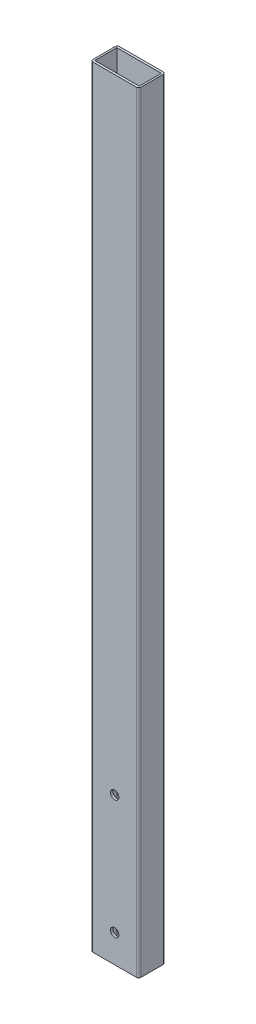
ISO-10303-21;
HEADER;
FILE_DESCRIPTION(('STEP AP214'),'2;1');
FILE_NAME('part.step','',(''),(''),'','','');
FILE_SCHEMA(('AUTOMOTIVE_DESIGN { 1 0 10303 214 1 1 1 1 }'));
ENDSEC;
DATA;
#1=APPLICATION_CONTEXT('core data for automotive mechanical design processes');
#2=APPLICATION_PROTOCOL_DEFINITION('international standard','automotive_design',2000,#1);
#3=PRODUCT_CONTEXT('',#1,'mechanical');
#4=PRODUCT('Part','Part','',(#3));
#5=PRODUCT_RELATED_PRODUCT_CATEGORY('part','',(#4));
#6=PRODUCT_DEFINITION_FORMATION('','',#4);
#7=PRODUCT_DEFINITION_CONTEXT('part definition',#1,'design');
#8=PRODUCT_DEFINITION('design','',#6,#7);
#9=PRODUCT_DEFINITION_SHAPE('','',#8);
#10=(LENGTH_UNIT() NAMED_UNIT(*) SI_UNIT(.MILLI.,.METRE.));
#11=(NAMED_UNIT(*) PLANE_ANGLE_UNIT() SI_UNIT($,.RADIAN.));
#12=(NAMED_UNIT(*) SI_UNIT($,.STERADIAN.) SOLID_ANGLE_UNIT());
#13=UNCERTAINTY_MEASURE_WITH_UNIT(LENGTH_MEASURE(1.E-05),#10,'distance_accuracy_value','');
#14=(GEOMETRIC_REPRESENTATION_CONTEXT(3) GLOBAL_UNCERTAINTY_ASSIGNED_CONTEXT((#13)) GLOBAL_UNIT_ASSIGNED_CONTEXT((#10,
#11,#12)) REPRESENTATION_CONTEXT('',''));
#15=CARTESIAN_POINT('',(0.,0.,0.));
#16=DIRECTION('',(0.,0.,1.));
#17=DIRECTION('',(1.,0.,0.));
#18=AXIS2_PLACEMENT_3D('',#15,#16,#17);
#19=CARTESIAN_POINT('',(0.,550.,0.));
#20=DIRECTION('',(0.,-1.,0.));
#21=DIRECTION('',(0.,0.,-1.));
#22=AXIS2_PLACEMENT_3D('',#19,#20,#21);
#23=PLANE('',#22);
#24=DIRECTION('',(-1.,0.,0.));
#25=VECTOR('',#24,1.);
#26=CARTESIAN_POINT('',(-17.145,550.,-9.525));
#27=LINE('',#26,#25);
#28=CARTESIAN_POINT('',(15.645,550.,-9.525));
#29=VERTEX_POINT('',#28);
#30=CARTESIAN_POINT('',(-15.645,550.,-9.525));
#31=VERTEX_POINT('',#30);
#32=EDGE_CURVE('E173',#29,#31,#27,.T.);
#33=ORIENTED_EDGE('',*,*,#32,.T.);
#34=CARTESIAN_POINT('',(-15.645,550.,-8.025));
#35=DIRECTION('',(0.,-1.,0.));
#36=DIRECTION('',(0.,0.,-1.));
#37=AXIS2_PLACEMENT_3D('',#34,#35,#36);
#38=CIRCLE('',#37,1.5);
#39=CARTESIAN_POINT('',(-17.145,550.,-8.025));
#40=VERTEX_POINT('',#39);
#41=EDGE_CURVE('E213',#31,#40,#38,.F.);
#42=ORIENTED_EDGE('',*,*,#41,.T.);
#43=DIRECTION('',(0.,0.,1.));
#44=VECTOR('',#43,1.);
#45=CARTESIAN_POINT('',(-17.145,550.,9.525));
#46=LINE('',#45,#44);
#47=CARTESIAN_POINT('',(-17.145,550.,8.025));
#48=VERTEX_POINT('',#47);
#49=EDGE_CURVE('E177',#40,#48,#46,.T.);
#50=ORIENTED_EDGE('',*,*,#49,.T.);
#51=CARTESIAN_POINT('',(-15.645,550.,8.025));
#52=DIRECTION('',(0.,-1.,0.));
#53=DIRECTION('',(0.,0.,-1.));
#54=AXIS2_PLACEMENT_3D('',#51,#52,#53);
#55=CIRCLE('',#54,1.5);
#56=CARTESIAN_POINT('',(-15.645,550.,9.525));
#57=VERTEX_POINT('',#56);
#58=EDGE_CURVE('E57',#48,#57,#55,.F.);
#59=ORIENTED_EDGE('',*,*,#58,.T.);
#60=DIRECTION('',(1.,0.,0.));
#61=VECTOR('',#60,1.);
#62=CARTESIAN_POINT('',(-17.145,550.,9.525));
#63=LINE('',#62,#61);
#64=CARTESIAN_POINT('',(15.645,550.,9.525));
#65=VERTEX_POINT('',#64);
#66=EDGE_CURVE('E179',#57,#65,#63,.T.);
#67=ORIENTED_EDGE('',*,*,#66,.T.);
#68=CARTESIAN_POINT('',(15.645,550.,8.025));
#69=DIRECTION('',(0.,-1.,0.));
#70=DIRECTION('',(0.,0.,-1.));
#71=AXIS2_PLACEMENT_3D('',#68,#69,#70);
#72=CIRCLE('',#71,1.5);
#73=CARTESIAN_POINT('',(17.145,550.,8.025));
#74=VERTEX_POINT('',#73);
#75=EDGE_CURVE('E208',#65,#74,#72,.F.);
#76=ORIENTED_EDGE('',*,*,#75,.T.);
#77=DIRECTION('',(0.,0.,-1.));
#78=VECTOR('',#77,1.);
#79=CARTESIAN_POINT('',(17.145,550.,9.525));
#80=LINE('',#79,#78);
#81=CARTESIAN_POINT('',(17.145,550.,-8.025));
#82=VERTEX_POINT('',#81);
#83=EDGE_CURVE('E170',#74,#82,#80,.T.);
#84=ORIENTED_EDGE('',*,*,#83,.T.);
#85=CARTESIAN_POINT('',(15.645,550.,-8.025));
#86=DIRECTION('',(0.,-1.,0.));
#87=DIRECTION('',(0.,0.,-1.));
#88=AXIS2_PLACEMENT_3D('',#85,#86,#87);
#89=CIRCLE('',#88,1.5);
#90=EDGE_CURVE('E211',#82,#29,#89,.F.);
#91=ORIENTED_EDGE('',*,*,#90,.T.);
#92=EDGE_LOOP('',(#33,#42,#50,#59,#67,#76,#84,#91));
#93=FACE_BOUND('',#92,.T.);
#94=DIRECTION('',(0.,0.,-1.));
#95=VECTOR('',#94,1.);
#96=CARTESIAN_POINT('',(15.875,550.,7.87400000000001));
#97=LINE('',#96,#95);
#98=CARTESIAN_POINT('',(15.875,550.,7.87400000000001));
#99=VERTEX_POINT('',#98);
#100=CARTESIAN_POINT('',(15.875,550.,-7.87399999999999));
#101=VERTEX_POINT('',#100);
#102=EDGE_CURVE('E127',#99,#101,#97,.T.);
#103=ORIENTED_EDGE('',*,*,#102,.F.);
#104=DIRECTION('',(1.,0.,0.));
#105=VECTOR('',#104,1.);
#106=CARTESIAN_POINT('',(-15.875,550.,7.87400000000001));
#107=LINE('',#106,#105);
#108=CARTESIAN_POINT('',(-15.875,550.,7.87400000000001));
#109=VERTEX_POINT('',#108);
#110=EDGE_CURVE('E152',#109,#99,#107,.T.);
#111=ORIENTED_EDGE('',*,*,#110,.F.);
#112=DIRECTION('',(0.,0.,1.));
#113=VECTOR('',#112,1.);
#114=CARTESIAN_POINT('',(-15.875,550.,7.87400000000001));
#115=LINE('',#114,#113);
#116=CARTESIAN_POINT('',(-15.875,550.,-7.87399999999999));
#117=VERTEX_POINT('',#116);
#118=EDGE_CURVE('E150',#117,#109,#115,.T.);
#119=ORIENTED_EDGE('',*,*,#118,.F.);
#120=DIRECTION('',(-1.,0.,0.));
#121=VECTOR('',#120,1.);
#122=CARTESIAN_POINT('',(-15.875,550.,-7.87399999999999));
#123=LINE('',#122,#121);
#124=EDGE_CURVE('E137',#101,#117,#123,.T.);
#125=ORIENTED_EDGE('',*,*,#124,.F.);
#126=EDGE_LOOP('',(#103,#111,#119,#125));
#127=FACE_BOUND('',#126,.T.);
#128=ADVANCED_FACE('F34',(#93,#127),#23,.F.);
#129=CARTESIAN_POINT('',(0.,0.,0.));
#130=DIRECTION('',(0.,-1.,0.));
#131=DIRECTION('',(0.,0.,-1.));
#132=AXIS2_PLACEMENT_3D('',#129,#130,#131);
#133=PLANE('',#132);
#134=DIRECTION('',(0.,0.,1.));
#135=VECTOR('',#134,1.);
#136=CARTESIAN_POINT('',(-17.145,0.,9.525));
#137=LINE('',#136,#135);
#138=CARTESIAN_POINT('',(-17.145,0.,-8.025));
#139=VERTEX_POINT('',#138);
#140=CARTESIAN_POINT('',(-17.145,0.,8.025));
#141=VERTEX_POINT('',#140);
#142=EDGE_CURVE('E187',#139,#141,#137,.T.);
#143=ORIENTED_EDGE('',*,*,#142,.F.);
#144=CARTESIAN_POINT('',(-15.645,0.,-8.025));
#145=DIRECTION('',(0.,-1.,0.));
#146=DIRECTION('',(0.,0.,-1.));
#147=AXIS2_PLACEMENT_3D('',#144,#145,#146);
#148=CIRCLE('',#147,1.5);
#149=CARTESIAN_POINT('',(-15.645,0.,-9.525));
#150=VERTEX_POINT('',#149);
#151=EDGE_CURVE('E201',#139,#150,#148,.T.);
#152=ORIENTED_EDGE('',*,*,#151,.T.);
#153=DIRECTION('',(-1.,0.,0.));
#154=VECTOR('',#153,1.);
#155=CARTESIAN_POINT('',(-17.145,0.,-9.525));
#156=LINE('',#155,#154);
#157=CARTESIAN_POINT('',(15.645,0.,-9.525));
#158=VERTEX_POINT('',#157);
#159=EDGE_CURVE('E184',#158,#150,#156,.T.);
#160=ORIENTED_EDGE('',*,*,#159,.F.);
#161=CARTESIAN_POINT('',(15.645,0.,-8.025));
#162=DIRECTION('',(0.,-1.,0.));
#163=DIRECTION('',(0.,0.,-1.));
#164=AXIS2_PLACEMENT_3D('',#161,#162,#163);
#165=CIRCLE('',#164,1.5);
#166=CARTESIAN_POINT('',(17.145,0.,-8.025));
#167=VERTEX_POINT('',#166);
#168=EDGE_CURVE('E199',#158,#167,#165,.T.);
#169=ORIENTED_EDGE('',*,*,#168,.T.);
#170=DIRECTION('',(0.,0.,-1.));
#171=VECTOR('',#170,1.);
#172=CARTESIAN_POINT('',(17.145,0.,9.525));
#173=LINE('',#172,#171);
#174=CARTESIAN_POINT('',(17.145,0.,8.025));
#175=VERTEX_POINT('',#174);
#176=EDGE_CURVE('E145',#175,#167,#173,.T.);
#177=ORIENTED_EDGE('',*,*,#176,.F.);
#178=CARTESIAN_POINT('',(15.645,0.,8.025));
#179=DIRECTION('',(0.,-1.,0.));
#180=DIRECTION('',(0.,0.,-1.));
#181=AXIS2_PLACEMENT_3D('',#178,#179,#180);
#182=CIRCLE('',#181,1.5);
#183=CARTESIAN_POINT('',(15.645,0.,9.525));
#184=VERTEX_POINT('',#183);
#185=EDGE_CURVE('E195',#175,#184,#182,.T.);
#186=ORIENTED_EDGE('',*,*,#185,.T.);
#187=DIRECTION('',(1.,0.,0.));
#188=VECTOR('',#187,1.);
#189=CARTESIAN_POINT('',(-17.145,0.,9.525));
#190=LINE('',#189,#188);
#191=CARTESIAN_POINT('',(-15.645,0.,9.525));
#192=VERTEX_POINT('',#191);
#193=EDGE_CURVE('E174',#192,#184,#190,.T.);
#194=ORIENTED_EDGE('',*,*,#193,.F.);
#195=CARTESIAN_POINT('',(-15.645,0.,8.025));
#196=DIRECTION('',(0.,-1.,0.));
#197=DIRECTION('',(0.,0.,-1.));
#198=AXIS2_PLACEMENT_3D('',#195,#196,#197);
#199=CIRCLE('',#198,1.5);
#200=EDGE_CURVE('E197',#192,#141,#199,.T.);
#201=ORIENTED_EDGE('',*,*,#200,.T.);
#202=EDGE_LOOP('',(#143,#152,#160,#169,#177,#186,#194,#201));
#203=FACE_BOUND('',#202,.T.);
#204=DIRECTION('',(1.,0.,0.));
#205=VECTOR('',#204,1.);
#206=CARTESIAN_POINT('',(-15.875,0.,7.87400000000001));
#207=LINE('',#206,#205);
#208=CARTESIAN_POINT('',(-15.875,0.,7.87400000000001));
#209=VERTEX_POINT('',#208);
#210=CARTESIAN_POINT('',(15.875,0.,7.87400000000001));
#211=VERTEX_POINT('',#210);
#212=EDGE_CURVE('E138',#209,#211,#207,.T.);
#213=ORIENTED_EDGE('',*,*,#212,.T.);
#214=DIRECTION('',(0.,0.,-1.));
#215=VECTOR('',#214,1.);
#216=CARTESIAN_POINT('',(15.875,0.,7.87400000000001));
#217=LINE('',#216,#215);
#218=CARTESIAN_POINT('',(15.875,0.,-7.87399999999999));
#219=VERTEX_POINT('',#218);
#220=EDGE_CURVE('E157',#211,#219,#217,.T.);
#221=ORIENTED_EDGE('',*,*,#220,.T.);
#222=DIRECTION('',(-1.,0.,0.));
#223=VECTOR('',#222,1.);
#224=CARTESIAN_POINT('',(-15.875,0.,-7.87399999999999));
#225=LINE('',#224,#223);
#226=CARTESIAN_POINT('',(-15.875,0.,-7.87399999999999));
#227=VERTEX_POINT('',#226);
#228=EDGE_CURVE('E144',#219,#227,#225,.T.);
#229=ORIENTED_EDGE('',*,*,#228,.T.);
#230=DIRECTION('',(0.,0.,1.));
#231=VECTOR('',#230,1.);
#232=CARTESIAN_POINT('',(-15.875,0.,7.87400000000001));
#233=LINE('',#232,#231);
#234=EDGE_CURVE('E161',#227,#209,#233,.T.);
#235=ORIENTED_EDGE('',*,*,#234,.T.);
#236=EDGE_LOOP('',(#213,#221,#229,#235));
#237=FACE_BOUND('',#236,.T.);
#238=ADVANCED_FACE('F264',(#203,#237),#133,.T.);
#239=CARTESIAN_POINT('',(17.145,550.,9.525));
#240=DIRECTION('',(-1.,0.,0.));
#241=DIRECTION('',(0.,0.,1.));
#242=AXIS2_PLACEMENT_3D('',#239,#240,#241);
#243=PLANE('',#242);
#244=ORIENTED_EDGE('',*,*,#176,.T.);
#245=DIRECTION('',(0.,-1.,0.));
#246=VECTOR('',#245,1.);
#247=CARTESIAN_POINT('',(17.145,550.,-8.025));
#248=LINE('',#247,#246);
#249=EDGE_CURVE('E218',#167,#82,#248,.F.);
#250=ORIENTED_EDGE('',*,*,#249,.T.);
#251=ORIENTED_EDGE('',*,*,#83,.F.);
#252=DIRECTION('',(0.,-1.,0.));
#253=VECTOR('',#252,1.);
#254=CARTESIAN_POINT('',(17.145,550.,8.025));
#255=LINE('',#254,#253);
#256=EDGE_CURVE('E215',#74,#175,#255,.T.);
#257=ORIENTED_EDGE('',*,*,#256,.T.);
#258=EDGE_LOOP('',(#244,#250,#251,#257));
#259=FACE_BOUND('',#258,.T.);
#260=ADVANCED_FACE('F269',(#259),#243,.F.);
#261=CARTESIAN_POINT('',(-17.145,550.,-9.525));
#262=DIRECTION('',(0.,0.,1.));
#263=DIRECTION('',(1.,0.,0.));
#264=AXIS2_PLACEMENT_3D('',#261,#262,#263);
#265=PLANE('',#264);
#266=CARTESIAN_POINT('',(0.,105.,-9.525));
#267=DIRECTION('',(0.,0.,1.));
#268=DIRECTION('',(1.,0.,0.));
#269=AXIS2_PLACEMENT_3D('',#266,#267,#268);
#270=CIRCLE('',#269,3.);
#271=CARTESIAN_POINT('',(3.,105.,-9.525));
#272=VERTEX_POINT('',#271);
#273=EDGE_CURVE('E223',#272,#272,#270,.T.);
#274=ORIENTED_EDGE('',*,*,#273,.T.);
#275=EDGE_LOOP('',(#274));
#276=FACE_BOUND('',#275,.T.);
#277=CARTESIAN_POINT('',(0.,20.,-9.525));
#278=DIRECTION('',(0.,0.,1.));
#279=DIRECTION('',(1.,0.,0.));
#280=AXIS2_PLACEMENT_3D('',#277,#278,#279);
#281=CIRCLE('',#280,3.);
#282=CARTESIAN_POINT('',(3.,20.,-9.525));
#283=VERTEX_POINT('',#282);
#284=EDGE_CURVE('E230',#283,#283,#281,.T.);
#285=ORIENTED_EDGE('',*,*,#284,.T.);
#286=EDGE_LOOP('',(#285));
#287=FACE_BOUND('',#286,.T.);
#288=ORIENTED_EDGE('',*,*,#159,.T.);
#289=DIRECTION('',(0.,-1.,0.));
#290=VECTOR('',#289,1.);
#291=CARTESIAN_POINT('',(-15.645,550.,-9.525));
#292=LINE('',#291,#290);
#293=EDGE_CURVE('E206',#150,#31,#292,.F.);
#294=ORIENTED_EDGE('',*,*,#293,.T.);
#295=ORIENTED_EDGE('',*,*,#32,.F.);
#296=DIRECTION('',(0.,-1.,0.));
#297=VECTOR('',#296,1.);
#298=CARTESIAN_POINT('',(15.645,550.,-9.525));
#299=LINE('',#298,#297);
#300=EDGE_CURVE('E203',#29,#158,#299,.T.);
#301=ORIENTED_EDGE('',*,*,#300,.T.);
#302=EDGE_LOOP('',(#288,#294,#295,#301));
#303=FACE_BOUND('',#302,.T.);
#304=ADVANCED_FACE('F280',(#276,#287,#303),#265,.F.);
#305=CARTESIAN_POINT('',(-17.145,550.,9.525));
#306=DIRECTION('',(1.,0.,0.));
#307=DIRECTION('',(0.,0.,-1.));
#308=AXIS2_PLACEMENT_3D('',#305,#306,#307);
#309=PLANE('',#308);
#310=ORIENTED_EDGE('',*,*,#49,.F.);
#311=DIRECTION('',(0.,-1.,0.));
#312=VECTOR('',#311,1.);
#313=CARTESIAN_POINT('',(-17.145,550.,-8.025));
#314=LINE('',#313,#312);
#315=EDGE_CURVE('E192',#40,#139,#314,.T.);
#316=ORIENTED_EDGE('',*,*,#315,.T.);
#317=ORIENTED_EDGE('',*,*,#142,.T.);
#318=DIRECTION('',(0.,-1.,0.));
#319=VECTOR('',#318,1.);
#320=CARTESIAN_POINT('',(-17.145,550.,8.025));
#321=LINE('',#320,#319);
#322=EDGE_CURVE('E181',#141,#48,#321,.F.);
#323=ORIENTED_EDGE('',*,*,#322,.T.);
#324=EDGE_LOOP('',(#310,#316,#317,#323));
#325=FACE_BOUND('',#324,.T.);
#326=ADVANCED_FACE('F277',(#325),#309,.F.);
#327=CARTESIAN_POINT('',(-17.145,550.,9.525));
#328=DIRECTION('',(0.,0.,-1.));
#329=DIRECTION('',(-1.,0.,0.));
#330=AXIS2_PLACEMENT_3D('',#327,#328,#329);
#331=PLANE('',#330);
#332=CARTESIAN_POINT('',(0.,105.,9.525));
#333=DIRECTION('',(0.,0.,-1.));
#334=DIRECTION('',(-1.,0.,0.));
#335=AXIS2_PLACEMENT_3D('',#332,#333,#334);
#336=CIRCLE('',#335,3.);
#337=CARTESIAN_POINT('',(-3.,105.,9.525));
#338=VERTEX_POINT('',#337);
#339=EDGE_CURVE('E159',#338,#338,#336,.T.);
#340=ORIENTED_EDGE('',*,*,#339,.T.);
#341=EDGE_LOOP('',(#340));
#342=FACE_BOUND('',#341,.T.);
#343=CARTESIAN_POINT('',(0.,20.,9.525));
#344=DIRECTION('',(0.,0.,-1.));
#345=DIRECTION('',(-1.,0.,0.));
#346=AXIS2_PLACEMENT_3D('',#343,#344,#345);
#347=CIRCLE('',#346,3.);
#348=CARTESIAN_POINT('',(-3.,20.,9.525));
#349=VERTEX_POINT('',#348);
#350=EDGE_CURVE('E227',#349,#349,#347,.T.);
#351=ORIENTED_EDGE('',*,*,#350,.T.);
#352=EDGE_LOOP('',(#351));
#353=FACE_BOUND('',#352,.T.);
#354=ORIENTED_EDGE('',*,*,#66,.F.);
#355=DIRECTION('',(0.,-1.,0.));
#356=VECTOR('',#355,1.);
#357=CARTESIAN_POINT('',(-15.645,550.,9.525));
#358=LINE('',#357,#356);
#359=EDGE_CURVE('E11',#57,#192,#358,.T.);
#360=ORIENTED_EDGE('',*,*,#359,.T.);
#361=ORIENTED_EDGE('',*,*,#193,.T.);
#362=DIRECTION('',(0.,-1.,0.));
#363=VECTOR('',#362,1.);
#364=CARTESIAN_POINT('',(15.645,550.,9.525));
#365=LINE('',#364,#363);
#366=EDGE_CURVE('E43',#184,#65,#365,.F.);
#367=ORIENTED_EDGE('',*,*,#366,.T.);
#368=EDGE_LOOP('',(#354,#360,#361,#367));
#369=FACE_BOUND('',#368,.T.);
#370=ADVANCED_FACE('F244',(#342,#353,#369),#331,.F.);
#371=CARTESIAN_POINT('',(15.875,550.,7.87400000000001));
#372=DIRECTION('',(-1.,0.,0.));
#373=DIRECTION('',(0.,0.,1.));
#374=AXIS2_PLACEMENT_3D('',#371,#372,#373);
#375=PLANE('',#374);
#376=ORIENTED_EDGE('',*,*,#220,.F.);
#377=DIRECTION('',(0.,-1.,0.));
#378=VECTOR('',#377,1.);
#379=CARTESIAN_POINT('',(15.875,550.,7.87400000000001));
#380=LINE('',#379,#378);
#381=EDGE_CURVE('E133',#99,#211,#380,.T.);
#382=ORIENTED_EDGE('',*,*,#381,.F.);
#383=ORIENTED_EDGE('',*,*,#102,.T.);
#384=DIRECTION('',(0.,-1.,0.));
#385=VECTOR('',#384,1.);
#386=CARTESIAN_POINT('',(15.875,550.,-7.87399999999999));
#387=LINE('',#386,#385);
#388=EDGE_CURVE('E130',#101,#219,#387,.T.);
#389=ORIENTED_EDGE('',*,*,#388,.T.);
#390=EDGE_LOOP('',(#376,#382,#383,#389));
#391=FACE_BOUND('',#390,.T.);
#392=ADVANCED_FACE('F129',(#391),#375,.T.);
#393=CARTESIAN_POINT('',(-15.875,550.,-7.87399999999999));
#394=DIRECTION('',(0.,0.,1.));
#395=DIRECTION('',(1.,0.,0.));
#396=AXIS2_PLACEMENT_3D('',#393,#394,#395);
#397=PLANE('',#396);
#398=CARTESIAN_POINT('',(0.,105.,-7.87399999999999));
#399=DIRECTION('',(0.,0.,1.));
#400=DIRECTION('',(1.,0.,0.));
#401=AXIS2_PLACEMENT_3D('',#398,#399,#400);
#402=CIRCLE('',#401,3.);
#403=CARTESIAN_POINT('',(3.,105.,-7.87399999999999));
#404=VERTEX_POINT('',#403);
#405=EDGE_CURVE('E239',#404,#404,#402,.T.);
#406=ORIENTED_EDGE('',*,*,#405,.F.);
#407=EDGE_LOOP('',(#406));
#408=FACE_BOUND('',#407,.T.);
#409=CARTESIAN_POINT('',(0.,20.,-7.87399999999999));
#410=DIRECTION('',(0.,0.,1.));
#411=DIRECTION('',(1.,0.,0.));
#412=AXIS2_PLACEMENT_3D('',#409,#410,#411);
#413=CIRCLE('',#412,3.);
#414=CARTESIAN_POINT('',(3.,20.,-7.87399999999999));
#415=VERTEX_POINT('',#414);
#416=EDGE_CURVE('E222',#415,#415,#413,.T.);
#417=ORIENTED_EDGE('',*,*,#416,.F.);
#418=EDGE_LOOP('',(#417));
#419=FACE_BOUND('',#418,.T.);
#420=ORIENTED_EDGE('',*,*,#228,.F.);
#421=ORIENTED_EDGE('',*,*,#388,.F.);
#422=ORIENTED_EDGE('',*,*,#124,.T.);
#423=DIRECTION('',(0.,-1.,0.));
#424=VECTOR('',#423,1.);
#425=CARTESIAN_POINT('',(-15.875,550.,-7.87399999999999));
#426=LINE('',#425,#424);
#427=EDGE_CURVE('E146',#117,#227,#426,.T.);
#428=ORIENTED_EDGE('',*,*,#427,.T.);
#429=EDGE_LOOP('',(#420,#421,#422,#428));
#430=FACE_BOUND('',#429,.T.);
#431=ADVANCED_FACE('F141',(#408,#419,#430),#397,.T.);
#432=CARTESIAN_POINT('',(-15.875,550.,7.87400000000001));
#433=DIRECTION('',(1.,0.,0.));
#434=DIRECTION('',(0.,0.,-1.));
#435=AXIS2_PLACEMENT_3D('',#432,#433,#434);
#436=PLANE('',#435);
#437=ORIENTED_EDGE('',*,*,#234,.F.);
#438=ORIENTED_EDGE('',*,*,#427,.F.);
#439=ORIENTED_EDGE('',*,*,#118,.T.);
#440=DIRECTION('',(0.,-1.,0.));
#441=VECTOR('',#440,1.);
#442=CARTESIAN_POINT('',(-15.875,550.,7.87400000000001));
#443=LINE('',#442,#441);
#444=EDGE_CURVE('E167',#109,#209,#443,.T.);
#445=ORIENTED_EDGE('',*,*,#444,.T.);
#446=EDGE_LOOP('',(#437,#438,#439,#445));
#447=FACE_BOUND('',#446,.T.);
#448=ADVANCED_FACE('F325',(#447),#436,.T.);
#449=CARTESIAN_POINT('',(-15.875,550.,7.87400000000001));
#450=DIRECTION('',(0.,0.,-1.));
#451=DIRECTION('',(-1.,0.,0.));
#452=AXIS2_PLACEMENT_3D('',#449,#450,#451);
#453=PLANE('',#452);
#454=CARTESIAN_POINT('',(0.,105.,7.87400000000001));
#455=DIRECTION('',(0.,0.,-1.));
#456=DIRECTION('',(-1.,0.,0.));
#457=AXIS2_PLACEMENT_3D('',#454,#455,#456);
#458=CIRCLE('',#457,3.);
#459=CARTESIAN_POINT('',(-3.,105.,7.87400000000001));
#460=VERTEX_POINT('',#459);
#461=EDGE_CURVE('E38',#460,#460,#458,.T.);
#462=ORIENTED_EDGE('',*,*,#461,.F.);
#463=EDGE_LOOP('',(#462));
#464=FACE_BOUND('',#463,.T.);
#465=CARTESIAN_POINT('',(0.,20.,7.87400000000001));
#466=DIRECTION('',(0.,0.,-1.));
#467=DIRECTION('',(-1.,0.,0.));
#468=AXIS2_PLACEMENT_3D('',#465,#466,#467);
#469=CIRCLE('',#468,3.);
#470=CARTESIAN_POINT('',(-3.,20.,7.87400000000001));
#471=VERTEX_POINT('',#470);
#472=EDGE_CURVE('E220',#471,#471,#469,.T.);
#473=ORIENTED_EDGE('',*,*,#472,.F.);
#474=EDGE_LOOP('',(#473));
#475=FACE_BOUND('',#474,.T.);
#476=ORIENTED_EDGE('',*,*,#212,.F.);
#477=ORIENTED_EDGE('',*,*,#444,.F.);
#478=ORIENTED_EDGE('',*,*,#110,.T.);
#479=ORIENTED_EDGE('',*,*,#381,.T.);
#480=EDGE_LOOP('',(#476,#477,#478,#479));
#481=FACE_BOUND('',#480,.T.);
#482=ADVANCED_FACE('F291',(#464,#475,#481),#453,.T.);
#483=CARTESIAN_POINT('',(-15.645,550.,-8.025));
#484=DIRECTION('',(0.,-1.,0.));
#485=DIRECTION('',(0.,0.,-1.));
#486=AXIS2_PLACEMENT_3D('',#483,#484,#485);
#487=CYLINDRICAL_SURFACE('',#486,1.5);
#488=ORIENTED_EDGE('',*,*,#41,.F.);
#489=ORIENTED_EDGE('',*,*,#293,.F.);
#490=ORIENTED_EDGE('',*,*,#151,.F.);
#491=ORIENTED_EDGE('',*,*,#315,.F.);
#492=EDGE_LOOP('',(#488,#489,#490,#491));
#493=FACE_BOUND('',#492,.T.);
#494=ADVANCED_FACE('F287',(#493),#487,.T.);
#495=CARTESIAN_POINT('',(15.645,550.,-8.025));
#496=DIRECTION('',(0.,-1.,0.));
#497=DIRECTION('',(0.,0.,-1.));
#498=AXIS2_PLACEMENT_3D('',#495,#496,#497);
#499=CYLINDRICAL_SURFACE('',#498,1.5);
#500=ORIENTED_EDGE('',*,*,#90,.F.);
#501=ORIENTED_EDGE('',*,*,#249,.F.);
#502=ORIENTED_EDGE('',*,*,#168,.F.);
#503=ORIENTED_EDGE('',*,*,#300,.F.);
#504=EDGE_LOOP('',(#500,#501,#502,#503));
#505=FACE_BOUND('',#504,.T.);
#506=ADVANCED_FACE('F290',(#505),#499,.T.);
#507=CARTESIAN_POINT('',(-15.645,550.,8.025));
#508=DIRECTION('',(0.,-1.,0.));
#509=DIRECTION('',(0.,0.,-1.));
#510=AXIS2_PLACEMENT_3D('',#507,#508,#509);
#511=CYLINDRICAL_SURFACE('',#510,1.5);
#512=ORIENTED_EDGE('',*,*,#58,.F.);
#513=ORIENTED_EDGE('',*,*,#322,.F.);
#514=ORIENTED_EDGE('',*,*,#200,.F.);
#515=ORIENTED_EDGE('',*,*,#359,.F.);
#516=EDGE_LOOP('',(#512,#513,#514,#515));
#517=FACE_BOUND('',#516,.T.);
#518=ADVANCED_FACE('F294',(#517),#511,.T.);
#519=CARTESIAN_POINT('',(15.645,550.,8.025));
#520=DIRECTION('',(0.,-1.,0.));
#521=DIRECTION('',(0.,0.,-1.));
#522=AXIS2_PLACEMENT_3D('',#519,#520,#521);
#523=CYLINDRICAL_SURFACE('',#522,1.5);
#524=ORIENTED_EDGE('',*,*,#75,.F.);
#525=ORIENTED_EDGE('',*,*,#366,.F.);
#526=ORIENTED_EDGE('',*,*,#185,.F.);
#527=ORIENTED_EDGE('',*,*,#256,.F.);
#528=EDGE_LOOP('',(#524,#525,#526,#527));
#529=FACE_BOUND('',#528,.T.);
#530=ADVANCED_FACE('F36',(#529),#523,.T.);
#531=CARTESIAN_POINT('',(0.,20.,-9.525));
#532=DIRECTION('',(0.,0.,1.));
#533=DIRECTION('',(1.,0.,0.));
#534=AXIS2_PLACEMENT_3D('',#531,#532,#533);
#535=CYLINDRICAL_SURFACE('',#534,3.);
#536=ORIENTED_EDGE('',*,*,#472,.T.);
#537=EDGE_LOOP('',(#536));
#538=FACE_BOUND('',#537,.T.);
#539=ORIENTED_EDGE('',*,*,#350,.F.);
#540=EDGE_LOOP('',(#539));
#541=FACE_BOUND('',#540,.T.);
#542=ADVANCED_FACE('F250',(#538,#541),#535,.F.);
#543=CARTESIAN_POINT('',(0.,105.,-9.525));
#544=DIRECTION('',(0.,0.,1.));
#545=DIRECTION('',(1.,0.,0.));
#546=AXIS2_PLACEMENT_3D('',#543,#544,#545);
#547=CYLINDRICAL_SURFACE('',#546,3.);
#548=ORIENTED_EDGE('',*,*,#461,.T.);
#549=EDGE_LOOP('',(#548));
#550=FACE_BOUND('',#549,.T.);
#551=ORIENTED_EDGE('',*,*,#339,.F.);
#552=EDGE_LOOP('',(#551));
#553=FACE_BOUND('',#552,.T.);
#554=ADVANCED_FACE('F247',(#550,#553),#547,.F.);
#555=ORIENTED_EDGE('',*,*,#416,.T.);
#556=EDGE_LOOP('',(#555));
#557=FACE_BOUND('',#556,.T.);
#558=ORIENTED_EDGE('',*,*,#284,.F.);
#559=EDGE_LOOP('',(#558));
#560=FACE_BOUND('',#559,.T.);
#561=ADVANCED_FACE('F249',(#557,#560),#535,.F.);
#562=ORIENTED_EDGE('',*,*,#405,.T.);
#563=EDGE_LOOP('',(#562));
#564=FACE_BOUND('',#563,.T.);
#565=ORIENTED_EDGE('',*,*,#273,.F.);
#566=EDGE_LOOP('',(#565));
#567=FACE_BOUND('',#566,.T.);
#568=ADVANCED_FACE('F253',(#564,#567),#547,.F.);
#569=CLOSED_SHELL('',(#128,#238,#260,#304,#326,#370,#392,#431,#448,#482,#494,#506,#518,#530,
#542,#554,#561,#568));
#570=MANIFOLD_SOLID_BREP('B2',#569);
#571=ADVANCED_BREP_SHAPE_REPRESENTATION('',(#18,#570),#14);
#572=SHAPE_DEFINITION_REPRESENTATION(#9,#571);
ENDSEC;
END-ISO-10303-21;
